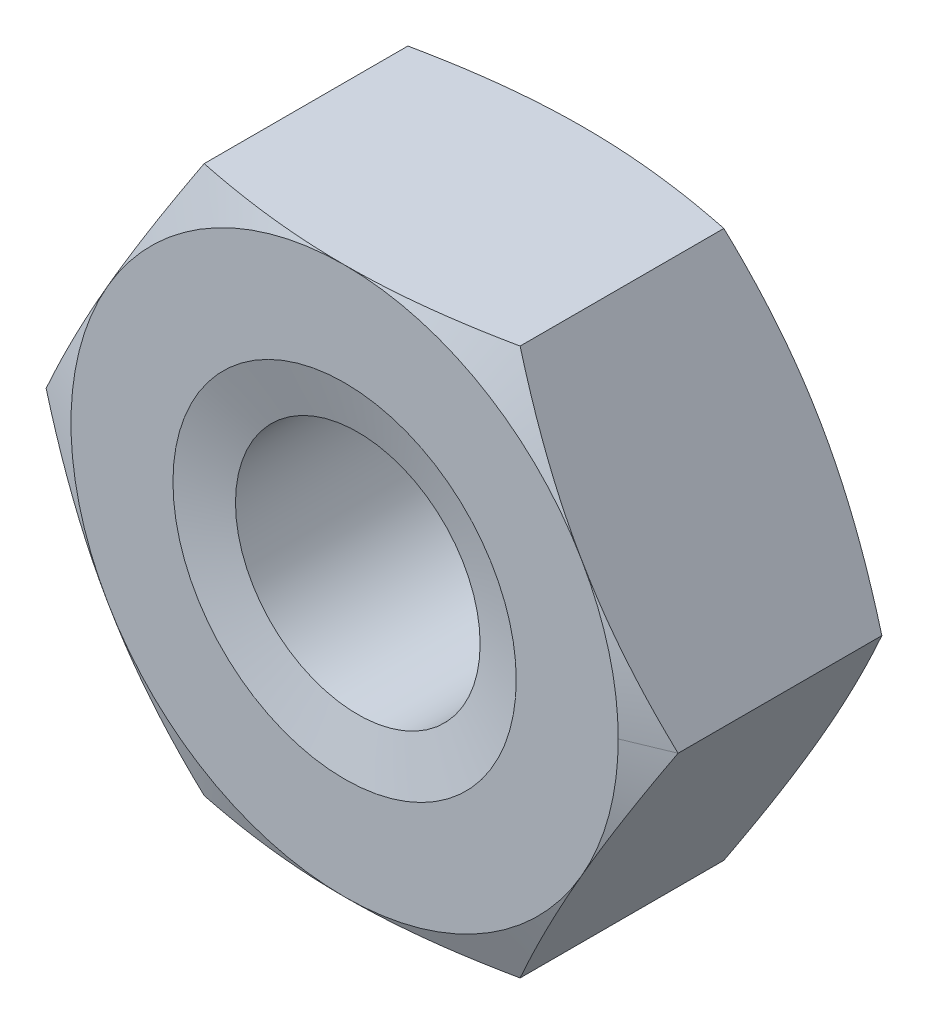
ISO-10303-21;
HEADER;
FILE_DESCRIPTION(('STEP AP214'),'2;1');
FILE_NAME('part.step','',(''),(''),'','','');
FILE_SCHEMA(('AUTOMOTIVE_DESIGN { 1 0 10303 214 1 1 1 1 }'));
ENDSEC;
DATA;
#1=APPLICATION_CONTEXT('core data for automotive mechanical design processes');
#2=APPLICATION_PROTOCOL_DEFINITION('international standard','automotive_design',2000,#1);
#3=PRODUCT_CONTEXT('',#1,'mechanical');
#4=PRODUCT('Part','Part','',(#3));
#5=PRODUCT_RELATED_PRODUCT_CATEGORY('part','',(#4));
#6=PRODUCT_DEFINITION_FORMATION('','',#4);
#7=PRODUCT_DEFINITION_CONTEXT('part definition',#1,'design');
#8=PRODUCT_DEFINITION('design','',#6,#7);
#9=PRODUCT_DEFINITION_SHAPE('','',#8);
#10=(LENGTH_UNIT() NAMED_UNIT(*) SI_UNIT(.MILLI.,.METRE.));
#11=(NAMED_UNIT(*) PLANE_ANGLE_UNIT() SI_UNIT($,.RADIAN.));
#12=(NAMED_UNIT(*) SI_UNIT($,.STERADIAN.) SOLID_ANGLE_UNIT());
#13=UNCERTAINTY_MEASURE_WITH_UNIT(LENGTH_MEASURE(1.E-05),#10,'distance_accuracy_value','');
#14=(GEOMETRIC_REPRESENTATION_CONTEXT(3) GLOBAL_UNCERTAINTY_ASSIGNED_CONTEXT((#13)) GLOBAL_UNIT_ASSIGNED_CONTEXT((#10,
#11,#12)) REPRESENTATION_CONTEXT('',''));
#15=CARTESIAN_POINT('',(0.,0.,0.));
#16=DIRECTION('',(0.,0.,1.));
#17=DIRECTION('',(1.,0.,0.));
#18=AXIS2_PLACEMENT_3D('',#15,#16,#17);
#19=CARTESIAN_POINT('',(0.05,0.05,5.876217418034));
#20=DIRECTION('',(0.,0.,1.));
#21=DIRECTION('',(1.,0.,0.));
#22=AXIS2_PLACEMENT_3D('',#19,#20,#21);
#23=CONICAL_SURFACE('',#22,3.175426480543,1.178097245096);
#24=CARTESIAN_POINT('',(0.05,0.05,5.7));
#25=DIRECTION('',(0.,0.,1.));
#26=DIRECTION('',(1.,0.,0.));
#27=AXIS2_PLACEMENT_3D('',#24,#25,#26);
#28=CIRCLE('',#27,2.75);
#29=CARTESIAN_POINT('',(2.431569853846,-1.325000011364,5.7));
#30=VERTEX_POINT('',#29);
#31=CARTESIAN_POINT('',(2.8,0.05,5.7));
#32=VERTEX_POINT('',#31);
#33=EDGE_CURVE('E174',#30,#32,#28,.T.);
#34=ORIENTED_EDGE('',*,*,#33,.T.);
#35=DIRECTION('',(-0.923879532511277,0.,-0.382683432365114));
#36=VECTOR('',#35,1.);
#37=CARTESIAN_POINT('',(3.225426480543,0.05,5.876217418034));
#38=LINE('',#37,#36);
#39=CARTESIAN_POINT('',(3.225426480543,0.05,5.876217418034));
#40=VERTEX_POINT('',#39);
#41=EDGE_CURVE('E11',#40,#32,#38,.T.);
#42=ORIENTED_EDGE('',*,*,#41,.F.);
#43=CARTESIAN_POINT('',(2.43156985384599,-1.325000011364,5.7));
#44=CARTESIAN_POINT('',(2.79999999648401,-0.686860285275428,5.69999999854361));
#45=CARTESIAN_POINT('',(3.22542648054335,0.0500000000003718,5.87621741803379));
#46=(BOUNDED_CURVE() B_SPLINE_CURVE(2,(#43,#44,#45),.UNSPECIFIED.,.F.,
.F.) B_SPLINE_CURVE_WITH_KNOTS((3,3),(0.,1.),
.UNSPECIFIED.) CURVE() GEOMETRIC_REPRESENTATION_ITEM() RATIONAL_B_SPLINE_CURVE((1.,
1.03795484996562,1.)) REPRESENTATION_ITEM(''));
#47=EDGE_CURVE('E185',#30,#40,#46,.T.);
#48=ORIENTED_EDGE('',*,*,#47,.F.);
#49=EDGE_LOOP('',(#34,#42,#48));
#50=FACE_BOUND('',#49,.T.);
#51=ADVANCED_FACE('F17',(#50),#23,.T.);
#52=CARTESIAN_POINT('',(0.05,0.05,5.876217418034));
#53=DIRECTION('',(0.,0.,1.));
#54=DIRECTION('',(1.,0.,0.));
#55=AXIS2_PLACEMENT_3D('',#52,#53,#54);
#56=CONICAL_SURFACE('',#55,3.175426480543,1.178097245096);
#57=CARTESIAN_POINT('',(0.05,0.05,5.7));
#58=DIRECTION('',(0.,0.,1.));
#59=DIRECTION('',(1.,0.,0.));
#60=AXIS2_PLACEMENT_3D('',#57,#58,#59);
#61=CIRCLE('',#60,2.75);
#62=CARTESIAN_POINT('',(0.05,-2.7,5.7));
#63=VERTEX_POINT('',#62);
#64=EDGE_CURVE('E48',#63,#30,#61,.T.);
#65=ORIENTED_EDGE('',*,*,#64,.T.);
#66=CARTESIAN_POINT('',(1.63771324027164,-2.69999999999865,5.87621741803338));
#67=CARTESIAN_POINT('',(2.06313971729833,-1.96313972690377,5.70000000145639));
#68=CARTESIAN_POINT('',(2.43156985384599,-1.325000011364,5.7));
#69=(BOUNDED_CURVE() B_SPLINE_CURVE(2,(#66,#67,#68),.UNSPECIFIED.,.F.,
.F.) B_SPLINE_CURVE_WITH_KNOTS((3,3),(0.,1.),
.UNSPECIFIED.) CURVE() GEOMETRIC_REPRESENTATION_ITEM() RATIONAL_B_SPLINE_CURVE((1.,
1.03795484863848,1.)) REPRESENTATION_ITEM(''));
#70=CARTESIAN_POINT('',(1.637713240271,-2.7,5.876217418034));
#71=VERTEX_POINT('',#70);
#72=EDGE_CURVE('E189',#71,#30,#69,.T.);
#73=ORIENTED_EDGE('',*,*,#72,.F.);
#74=CARTESIAN_POINT('',(0.05,-2.7,5.7));
#75=CARTESIAN_POINT('',(0.786860279185758,-2.7,5.70000000000001));
#76=CARTESIAN_POINT('',(1.6377132402719,-2.7,5.87621741803363));
#77=(BOUNDED_CURVE() B_SPLINE_CURVE(2,(#74,#75,#76),.UNSPECIFIED.,.F.,
.F.) B_SPLINE_CURVE_WITH_KNOTS((3,3),(0.,1.),
.UNSPECIFIED.) CURVE() GEOMETRIC_REPRESENTATION_ITEM() RATIONAL_B_SPLINE_CURVE((1.,
1.03795484930206,1.)) REPRESENTATION_ITEM(''));
#78=EDGE_CURVE('E181',#63,#71,#77,.T.);
#79=ORIENTED_EDGE('',*,*,#78,.F.);
#80=EDGE_LOOP('',(#65,#73,#79));
#81=FACE_BOUND('',#80,.T.);
#82=ADVANCED_FACE('F188',(#81),#56,.T.);
#83=CARTESIAN_POINT('',(0.05,0.05,5.876217418034));
#84=DIRECTION('',(0.,0.,1.));
#85=DIRECTION('',(1.,0.,0.));
#86=AXIS2_PLACEMENT_3D('',#83,#84,#85);
#87=CONICAL_SURFACE('',#86,3.175426480543,1.178097245096);
#88=CARTESIAN_POINT('',(0.05,0.05,5.7));
#89=DIRECTION('',(0.,0.,1.));
#90=DIRECTION('',(1.,0.,0.));
#91=AXIS2_PLACEMENT_3D('',#88,#89,#90);
#92=CIRCLE('',#91,2.75);
#93=CARTESIAN_POINT('',(-2.331569853846,-1.325000011364,5.7));
#94=VERTEX_POINT('',#93);
#95=EDGE_CURVE('E159',#94,#63,#92,.T.);
#96=ORIENTED_EDGE('',*,*,#95,.T.);
#97=CARTESIAN_POINT('',(-1.5377132402703,-2.7,5.8762174180333));
#98=CARTESIAN_POINT('',(-0.686860279185117,-2.7,5.7));
#99=CARTESIAN_POINT('',(0.05,-2.7,5.7));
#100=(BOUNDED_CURVE() B_SPLINE_CURVE(2,(#97,#98,#99),.UNSPECIFIED.,.F.,
.F.) B_SPLINE_CURVE_WITH_KNOTS((3,3),(0.,1.),
.UNSPECIFIED.) CURVE() GEOMETRIC_REPRESENTATION_ITEM() RATIONAL_B_SPLINE_CURVE((1.,
1.037954849302,1.)) REPRESENTATION_ITEM(''));
#101=CARTESIAN_POINT('',(-1.537713240272,-2.7,5.876217418034));
#102=VERTEX_POINT('',#101);
#103=EDGE_CURVE('E162',#102,#63,#100,.T.);
#104=ORIENTED_EDGE('',*,*,#103,.F.);
#105=CARTESIAN_POINT('',(-2.331569853846,-1.325000011364,5.7));
#106=CARTESIAN_POINT('',(-1.96313971729799,-1.96313972690435,5.70000000145639));
#107=CARTESIAN_POINT('',(-1.53771324027081,-2.70000000000008,5.87621741803372));
#108=(BOUNDED_CURVE() B_SPLINE_CURVE(2,(#105,#106,#107),.UNSPECIFIED.,.F.,
.F.) B_SPLINE_CURVE_WITH_KNOTS((3,3),(0.,1.),
.UNSPECIFIED.) CURVE() GEOMETRIC_REPRESENTATION_ITEM() RATIONAL_B_SPLINE_CURVE((1.,
1.03795484863855,1.)) REPRESENTATION_ITEM(''));
#109=EDGE_CURVE('E165',#94,#102,#108,.T.);
#110=ORIENTED_EDGE('',*,*,#109,.F.);
#111=EDGE_LOOP('',(#96,#104,#110));
#112=FACE_BOUND('',#111,.T.);
#113=ADVANCED_FACE('F160',(#112),#87,.T.);
#114=CARTESIAN_POINT('',(0.05,0.05,5.876217418034));
#115=DIRECTION('',(0.,0.,1.));
#116=DIRECTION('',(1.,0.,0.));
#117=AXIS2_PLACEMENT_3D('',#114,#115,#116);
#118=CONICAL_SURFACE('',#117,3.175426480543,1.178097245096);
#119=CARTESIAN_POINT('',(0.05,0.05,5.7));
#120=DIRECTION('',(0.,0.,1.));
#121=DIRECTION('',(1.,0.,0.));
#122=AXIS2_PLACEMENT_3D('',#119,#120,#121);
#123=CIRCLE('',#122,2.75);
#124=CARTESIAN_POINT('',(-2.331569852224,1.425000014173,5.7));
#125=VERTEX_POINT('',#124);
#126=EDGE_CURVE('E170',#125,#94,#123,.T.);
#127=ORIENTED_EDGE('',*,*,#126,.T.);
#128=CARTESIAN_POINT('',(-3.12542648054229,0.0499999999985272,5.87621741803335));
#129=CARTESIAN_POINT('',(-2.69999999648359,-0.686860285276169,5.69999999854362));
#130=CARTESIAN_POINT('',(-2.331569853846,-1.325000011364,5.7));
#131=(BOUNDED_CURVE() B_SPLINE_CURVE(2,(#128,#129,#130),.UNSPECIFIED.,.F.,
.F.) B_SPLINE_CURVE_WITH_KNOTS((3,3),(0.,1.),
.UNSPECIFIED.) CURVE() GEOMETRIC_REPRESENTATION_ITEM() RATIONAL_B_SPLINE_CURVE((1.,
1.03795484996554,1.)) REPRESENTATION_ITEM(''));
#132=CARTESIAN_POINT('',(-3.125426480543,0.04999999999992,5.876217418034));
#133=VERTEX_POINT('',#132);
#134=EDGE_CURVE('E192',#133,#94,#131,.T.);
#135=ORIENTED_EDGE('',*,*,#134,.F.);
#136=CARTESIAN_POINT('',(-2.33156985222416,1.42500001417309,5.7));
#137=CARTESIAN_POINT('',(-2.69999999561488,0.786860286780804,5.6999999981836));
#138=CARTESIAN_POINT('',(-3.12542648054337,0.0499999999995886,5.8762174180338));
#139=(BOUNDED_CURVE() B_SPLINE_CURVE(2,(#136,#137,#138),.UNSPECIFIED.,.F.,
.F.) B_SPLINE_CURVE_WITH_KNOTS((3,3),(0.,1.),
.UNSPECIFIED.) CURVE() GEOMETRIC_REPRESENTATION_ITEM() RATIONAL_B_SPLINE_CURVE((1.,
1.0379548501297,1.)) REPRESENTATION_ITEM(''));
#140=EDGE_CURVE('E380',#125,#133,#139,.T.);
#141=ORIENTED_EDGE('',*,*,#140,.F.);
#142=EDGE_LOOP('',(#127,#135,#141));
#143=FACE_BOUND('',#142,.T.);
#144=ADVANCED_FACE('F557',(#143),#118,.T.);
#145=CARTESIAN_POINT('',(0.05,0.05,5.876217418034));
#146=DIRECTION('',(0.,0.,1.));
#147=DIRECTION('',(1.,0.,0.));
#148=AXIS2_PLACEMENT_3D('',#145,#146,#147);
#149=CONICAL_SURFACE('',#148,3.175426480543,1.178097245096);
#150=CARTESIAN_POINT('',(0.05,0.05,5.7));
#151=DIRECTION('',(0.,0.,1.));
#152=DIRECTION('',(1.,0.,0.));
#153=AXIS2_PLACEMENT_3D('',#150,#151,#152);
#154=CIRCLE('',#153,2.75);
#155=CARTESIAN_POINT('',(0.05000000000001,2.8,5.7));
#156=VERTEX_POINT('',#155);
#157=EDGE_CURVE('E222',#156,#125,#154,.T.);
#158=ORIENTED_EDGE('',*,*,#157,.T.);
#159=CARTESIAN_POINT('',(-1.53771324027214,2.79999999999778,5.87621741803317));
#160=CARTESIAN_POINT('',(-1.96313971642939,2.06313972840882,5.70000000181639));
#161=CARTESIAN_POINT('',(-2.33156985222416,1.42500001417309,5.7));
#162=(BOUNDED_CURVE() B_SPLINE_CURVE(2,(#159,#160,#161),.UNSPECIFIED.,.F.,
.F.) B_SPLINE_CURVE_WITH_KNOTS((3,3),(0.,1.),
.UNSPECIFIED.) CURVE() GEOMETRIC_REPRESENTATION_ITEM() RATIONAL_B_SPLINE_CURVE((1.,
1.03795484847438,1.)) REPRESENTATION_ITEM(''));
#163=CARTESIAN_POINT('',(-1.537713240272,2.8,5.876217418034));
#164=VERTEX_POINT('',#163);
#165=EDGE_CURVE('E390',#164,#125,#162,.T.);
#166=ORIENTED_EDGE('',*,*,#165,.F.);
#167=CARTESIAN_POINT('',(0.0500000000000101,2.8,5.7));
#168=CARTESIAN_POINT('',(-0.686860279186023,2.8,5.70000000000001));
#169=CARTESIAN_POINT('',(-1.53771324027256,2.8,5.87621741803377));
#170=(BOUNDED_CURVE() B_SPLINE_CURVE(2,(#167,#168,#169),.UNSPECIFIED.,.F.,
.F.) B_SPLINE_CURVE_WITH_KNOTS((3,3),(0.,1.),
.UNSPECIFIED.) CURVE() GEOMETRIC_REPRESENTATION_ITEM() RATIONAL_B_SPLINE_CURVE((1.,
1.03795484930212,1.)) REPRESENTATION_ITEM(''));
#171=EDGE_CURVE('E273',#156,#164,#170,.T.);
#172=ORIENTED_EDGE('',*,*,#171,.F.);
#173=EDGE_LOOP('',(#158,#166,#172));
#174=FACE_BOUND('',#173,.T.);
#175=ADVANCED_FACE('F561',(#174),#149,.T.);
#176=CARTESIAN_POINT('',(0.05,0.05,5.876217418034));
#177=DIRECTION('',(0.,0.,1.));
#178=DIRECTION('',(1.,0.,0.));
#179=AXIS2_PLACEMENT_3D('',#176,#177,#178);
#180=CONICAL_SURFACE('',#179,3.175426480543,1.178097245096);
#181=CARTESIAN_POINT('',(0.05,0.05,5.7));
#182=DIRECTION('',(0.,0.,1.));
#183=DIRECTION('',(1.,0.,0.));
#184=AXIS2_PLACEMENT_3D('',#181,#182,#183);
#185=CIRCLE('',#184,2.75);
#186=CARTESIAN_POINT('',(2.431569853846,1.425000011364,5.7));
#187=VERTEX_POINT('',#186);
#188=EDGE_CURVE('E224',#187,#156,#185,.T.);
#189=ORIENTED_EDGE('',*,*,#188,.T.);
#190=CARTESIAN_POINT('',(1.6377132402683,2.8,5.87621741803288));
#191=CARTESIAN_POINT('',(0.78686027918432,2.8,5.7));
#192=CARTESIAN_POINT('',(0.0500000000000101,2.8,5.7));
#193=(BOUNDED_CURVE() B_SPLINE_CURVE(2,(#190,#191,#192),.UNSPECIFIED.,.F.,
.F.) B_SPLINE_CURVE_WITH_KNOTS((3,3),(0.,1.),
.UNSPECIFIED.) CURVE() GEOMETRIC_REPRESENTATION_ITEM() RATIONAL_B_SPLINE_CURVE((1.,
1.0379548493019,1.)) REPRESENTATION_ITEM(''));
#194=CARTESIAN_POINT('',(1.637713240271,2.8,5.876217418034));
#195=VERTEX_POINT('',#194);
#196=EDGE_CURVE('E374',#195,#156,#193,.T.);
#197=ORIENTED_EDGE('',*,*,#196,.F.);
#198=CARTESIAN_POINT('',(2.43156985384599,1.425000011364,5.7));
#199=CARTESIAN_POINT('',(2.06313971729793,2.06313972690447,5.70000000145639));
#200=CARTESIAN_POINT('',(1.63771324027065,2.80000000000037,5.87621741803379));
#201=(BOUNDED_CURVE() B_SPLINE_CURVE(2,(#198,#199,#200),.UNSPECIFIED.,.F.,
.F.) B_SPLINE_CURVE_WITH_KNOTS((3,3),(0.,1.),
.UNSPECIFIED.) CURVE() GEOMETRIC_REPRESENTATION_ITEM() RATIONAL_B_SPLINE_CURVE((1.,
1.0379548486386,1.)) REPRESENTATION_ITEM(''));
#202=EDGE_CURVE('E353',#187,#195,#201,.T.);
#203=ORIENTED_EDGE('',*,*,#202,.F.);
#204=EDGE_LOOP('',(#189,#197,#203));
#205=FACE_BOUND('',#204,.T.);
#206=ADVANCED_FACE('F523',(#205),#180,.T.);
#207=CARTESIAN_POINT('',(0.05,0.05,5.876217418034));
#208=DIRECTION('',(0.,0.,1.));
#209=DIRECTION('',(1.,0.,0.));
#210=AXIS2_PLACEMENT_3D('',#207,#208,#209);
#211=CONICAL_SURFACE('',#210,3.175426480543,1.178097245096);
#212=CARTESIAN_POINT('',(0.05,0.05,5.7));
#213=DIRECTION('',(0.,0.,1.));
#214=DIRECTION('',(1.,0.,0.));
#215=AXIS2_PLACEMENT_3D('',#212,#213,#214);
#216=CIRCLE('',#215,2.75);
#217=EDGE_CURVE('E25',#32,#187,#216,.T.);
#218=ORIENTED_EDGE('',*,*,#217,.T.);
#219=CARTESIAN_POINT('',(3.22542648054235,0.0500000000013523,5.87621741803338));
#220=CARTESIAN_POINT('',(2.7999999964836,0.786860285276121,5.6999999985436));
#221=CARTESIAN_POINT('',(2.43156985384599,1.425000011364,5.7));
#222=(BOUNDED_CURVE() B_SPLINE_CURVE(2,(#219,#220,#221),.UNSPECIFIED.,.F.,
.F.) B_SPLINE_CURVE_WITH_KNOTS((3,3),(0.,1.),
.UNSPECIFIED.) CURVE() GEOMETRIC_REPRESENTATION_ITEM() RATIONAL_B_SPLINE_CURVE((1.,
1.03795484996555,1.)) REPRESENTATION_ITEM(''));
#223=EDGE_CURVE('E283',#40,#187,#222,.T.);
#224=ORIENTED_EDGE('',*,*,#223,.F.);
#225=ORIENTED_EDGE('',*,*,#41,.T.);
#226=EDGE_LOOP('',(#218,#224,#225));
#227=FACE_BOUND('',#226,.T.);
#228=ADVANCED_FACE('F514',(#227),#211,.T.);
#229=CARTESIAN_POINT('',(0.05,0.05,5.7));
#230=DIRECTION('',(0.,0.,1.));
#231=DIRECTION('',(1.,0.,0.));
#232=AXIS2_PLACEMENT_3D('',#229,#230,#231);
#233=PLANE('',#232);
#234=CARTESIAN_POINT('',(0.05,0.05,5.7));
#235=DIRECTION('',(0.,0.,1.));
#236=DIRECTION('',(1.,0.,0.));
#237=AXIS2_PLACEMENT_3D('',#234,#235,#236);
#238=CIRCLE('',#237,1.725);
#239=CARTESIAN_POINT('',(1.775,0.05,5.7));
#240=VERTEX_POINT('',#239);
#241=EDGE_CURVE('E347',#240,#240,#238,.T.);
#242=ORIENTED_EDGE('',*,*,#241,.T.);
#243=EDGE_LOOP('',(#242));
#244=FACE_BOUND('',#243,.T.);
#245=ORIENTED_EDGE('',*,*,#33,.F.);
#246=ORIENTED_EDGE('',*,*,#64,.F.);
#247=ORIENTED_EDGE('',*,*,#95,.F.);
#248=ORIENTED_EDGE('',*,*,#126,.F.);
#249=ORIENTED_EDGE('',*,*,#157,.F.);
#250=ORIENTED_EDGE('',*,*,#188,.F.);
#251=ORIENTED_EDGE('',*,*,#217,.F.);
#252=EDGE_LOOP('',(#245,#246,#247,#248,#249,#250,#251));
#253=FACE_BOUND('',#252,.T.);
#254=ADVANCED_FACE('F172',(#244,#253),#233,.F.);
#255=CARTESIAN_POINT('',(1.637713240271,-2.7,5.7));
#256=DIRECTION('',(-0.866025403784329,0.50000000000019,0.));
#257=DIRECTION('',(0.,0.,1.));
#258=AXIS2_PLACEMENT_3D('',#255,#256,#257);
#259=PLANE('',#258);
#260=ORIENTED_EDGE('',*,*,#47,.T.);
#261=DIRECTION('',(0.,0.,-1.));
#262=VECTOR('',#261,1.);
#263=CARTESIAN_POINT('',(3.225426480543,0.05,7.923782581966));
#264=LINE('',#263,#262);
#265=CARTESIAN_POINT('',(3.225426480543,0.05,7.923782581966));
#266=VERTEX_POINT('',#265);
#267=EDGE_CURVE('E301',#266,#40,#264,.T.);
#268=ORIENTED_EDGE('',*,*,#267,.F.);
#269=CARTESIAN_POINT('',(3.22542648054235,0.0499999999986478,7.92378258196662));
#270=CARTESIAN_POINT('',(2.7999999964836,-0.686860285276121,8.10000000145638));
#271=CARTESIAN_POINT('',(2.43156985384599,-1.325000011364,8.1));
#272=(BOUNDED_CURVE() B_SPLINE_CURVE(2,(#269,#270,#271),.UNSPECIFIED.,.F.,
.F.) B_SPLINE_CURVE_WITH_KNOTS((3,3),(0.,1.),
.UNSPECIFIED.) CURVE() GEOMETRIC_REPRESENTATION_ITEM() RATIONAL_B_SPLINE_CURVE((1.,
1.03795484996555,1.)) REPRESENTATION_ITEM(''));
#273=CARTESIAN_POINT('',(2.431569853846,-1.325000011364,8.1));
#274=VERTEX_POINT('',#273);
#275=EDGE_CURVE('E338',#266,#274,#272,.T.);
#276=ORIENTED_EDGE('',*,*,#275,.T.);
#277=CARTESIAN_POINT('',(2.43156985384599,-1.325000011364,8.1));
#278=CARTESIAN_POINT('',(2.06313971729793,-1.96313972690447,8.09999999854361));
#279=CARTESIAN_POINT('',(1.63771324027065,-2.70000000000037,7.92378258196621));
#280=(BOUNDED_CURVE() B_SPLINE_CURVE(2,(#277,#278,#279),.UNSPECIFIED.,.F.,
.F.) B_SPLINE_CURVE_WITH_KNOTS((3,3),(0.,1.),
.UNSPECIFIED.) CURVE() GEOMETRIC_REPRESENTATION_ITEM() RATIONAL_B_SPLINE_CURVE((1.,
1.03795484863856,1.)) REPRESENTATION_ITEM(''));
#281=CARTESIAN_POINT('',(1.637713240271,-2.7,7.923782581966));
#282=VERTEX_POINT('',#281);
#283=EDGE_CURVE('E329',#274,#282,#280,.T.);
#284=ORIENTED_EDGE('',*,*,#283,.T.);
#285=DIRECTION('',(0.,0.,1.));
#286=VECTOR('',#285,1.);
#287=CARTESIAN_POINT('',(1.637713240271,-2.7,5.7));
#288=LINE('',#287,#286);
#289=EDGE_CURVE('E186',#71,#282,#288,.T.);
#290=ORIENTED_EDGE('',*,*,#289,.F.);
#291=ORIENTED_EDGE('',*,*,#72,.T.);
#292=EDGE_LOOP('',(#260,#268,#276,#284,#290,#291));
#293=FACE_BOUND('',#292,.T.);
#294=ADVANCED_FACE('F513',(#293),#259,.F.);
#295=CARTESIAN_POINT('',(-1.537713240271,-2.7,5.7));
#296=DIRECTION('',(0.,1.,0.));
#297=DIRECTION('',(1.,0.,0.));
#298=AXIS2_PLACEMENT_3D('',#295,#296,#297);
#299=PLANE('',#298);
#300=ORIENTED_EDGE('',*,*,#78,.T.);
#301=ORIENTED_EDGE('',*,*,#289,.T.);
#302=CARTESIAN_POINT('',(1.6377132402683,-2.7,7.92378258196712));
#303=CARTESIAN_POINT('',(0.786860279184316,-2.70000000000001,8.10000000000001));
#304=CARTESIAN_POINT('',(0.05,-2.7,8.1));
#305=(BOUNDED_CURVE() B_SPLINE_CURVE(2,(#302,#303,#304),.UNSPECIFIED.,.F.,
.F.) B_SPLINE_CURVE_WITH_KNOTS((3,3),(0.,1.),
.UNSPECIFIED.) CURVE() GEOMETRIC_REPRESENTATION_ITEM() RATIONAL_B_SPLINE_CURVE((1.,
1.03795484930192,1.)) REPRESENTATION_ITEM(''));
#306=CARTESIAN_POINT('',(0.05,-2.7,8.1));
#307=VERTEX_POINT('',#306);
#308=EDGE_CURVE('E321',#282,#307,#305,.T.);
#309=ORIENTED_EDGE('',*,*,#308,.T.);
#310=CARTESIAN_POINT('',(0.05,-2.7,8.1));
#311=CARTESIAN_POINT('',(-0.68686027918603,-2.7,8.10000000000001));
#312=CARTESIAN_POINT('',(-1.53771324027256,-2.7,7.92378258196624));
#313=(BOUNDED_CURVE() B_SPLINE_CURVE(2,(#310,#311,#312),.UNSPECIFIED.,.F.,
.F.) B_SPLINE_CURVE_WITH_KNOTS((3,3),(0.,1.),
.UNSPECIFIED.) CURVE() GEOMETRIC_REPRESENTATION_ITEM() RATIONAL_B_SPLINE_CURVE((1.,
1.0379548493021,1.)) REPRESENTATION_ITEM(''));
#314=CARTESIAN_POINT('',(-1.537713240272,-2.7,7.923782581966));
#315=VERTEX_POINT('',#314);
#316=EDGE_CURVE('E313',#307,#315,#313,.T.);
#317=ORIENTED_EDGE('',*,*,#316,.T.);
#318=DIRECTION('',(0.,0.,1.));
#319=VECTOR('',#318,1.);
#320=CARTESIAN_POINT('',(-1.537713240271,-2.7,5.7));
#321=LINE('',#320,#319);
#322=EDGE_CURVE('E183',#102,#315,#321,.T.);
#323=ORIENTED_EDGE('',*,*,#322,.F.);
#324=ORIENTED_EDGE('',*,*,#103,.T.);
#325=EDGE_LOOP('',(#300,#301,#309,#317,#323,#324));
#326=FACE_BOUND('',#325,.T.);
#327=ADVANCED_FACE('F180',(#326),#299,.F.);
#328=CARTESIAN_POINT('',(-3.125426480543,0.05,5.7));
#329=DIRECTION('',(0.866025403784329,0.50000000000019,0.));
#330=DIRECTION('',(0.,0.,-1.));
#331=AXIS2_PLACEMENT_3D('',#328,#329,#330);
#332=PLANE('',#331);
#333=ORIENTED_EDGE('',*,*,#109,.T.);
#334=ORIENTED_EDGE('',*,*,#322,.T.);
#335=CARTESIAN_POINT('',(-1.53771324027214,-2.69999999999778,7.92378258196683));
#336=CARTESIAN_POINT('',(-1.96313971729852,-1.96313972690343,8.09999999854361));
#337=CARTESIAN_POINT('',(-2.331569853846,-1.325000011364,8.1));
#338=(BOUNDED_CURVE() B_SPLINE_CURVE(2,(#335,#336,#337),.UNSPECIFIED.,.F.,
.F.) B_SPLINE_CURVE_WITH_KNOTS((3,3),(0.,1.),
.UNSPECIFIED.) CURVE() GEOMETRIC_REPRESENTATION_ITEM() RATIONAL_B_SPLINE_CURVE((1.,
1.03795484863841,1.)) REPRESENTATION_ITEM(''));
#339=CARTESIAN_POINT('',(-2.331569853846,-1.325000011364,8.1));
#340=VERTEX_POINT('',#339);
#341=EDGE_CURVE('E300',#315,#340,#338,.T.);
#342=ORIENTED_EDGE('',*,*,#341,.T.);
#343=CARTESIAN_POINT('',(-2.331569853846,-1.325000011364,8.1));
#344=CARTESIAN_POINT('',(-2.699999996484,-0.686860285275444,8.10000000145639));
#345=CARTESIAN_POINT('',(-3.12542648054333,0.0500000000003313,7.92378258196622));
#346=(BOUNDED_CURVE() B_SPLINE_CURVE(2,(#343,#344,#345),.UNSPECIFIED.,.F.,
.F.) B_SPLINE_CURVE_WITH_KNOTS((3,3),(0.,1.),
.UNSPECIFIED.) CURVE() GEOMETRIC_REPRESENTATION_ITEM() RATIONAL_B_SPLINE_CURVE((1.,
1.03795484996559,1.)) REPRESENTATION_ITEM(''));
#347=CARTESIAN_POINT('',(-3.125426480543,0.04999999999992,7.923782581966));
#348=VERTEX_POINT('',#347);
#349=EDGE_CURVE('E272',#340,#348,#346,.T.);
#350=ORIENTED_EDGE('',*,*,#349,.T.);
#351=DIRECTION('',(0.,0.,1.));
#352=VECTOR('',#351,1.);
#353=CARTESIAN_POINT('',(-3.125426480543,0.05,5.7));
#354=LINE('',#353,#352);
#355=EDGE_CURVE('E389',#133,#348,#354,.T.);
#356=ORIENTED_EDGE('',*,*,#355,.F.);
#357=ORIENTED_EDGE('',*,*,#134,.T.);
#358=EDGE_LOOP('',(#333,#334,#342,#350,#356,#357));
#359=FACE_BOUND('',#358,.T.);
#360=ADVANCED_FACE('F411',(#359),#332,.F.);
#361=CARTESIAN_POINT('',(-1.537713240271,2.8,5.7));
#362=DIRECTION('',(0.866025403784329,-0.50000000000019,0.));
#363=DIRECTION('',(0.,0.,-1.));
#364=AXIS2_PLACEMENT_3D('',#361,#362,#363);
#365=PLANE('',#364);
#366=ORIENTED_EDGE('',*,*,#140,.T.);
#367=ORIENTED_EDGE('',*,*,#355,.T.);
#368=CARTESIAN_POINT('',(-3.12542648054243,0.0500000000012324,7.92378258196659));
#369=CARTESIAN_POINT('',(-2.6999999956145,0.786860286781462,8.10000000181639));
#370=CARTESIAN_POINT('',(-2.33156985222416,1.42500001417309,8.1));
#371=(BOUNDED_CURVE() B_SPLINE_CURVE(2,(#368,#369,#370),.UNSPECIFIED.,.F.,
.F.) B_SPLINE_CURVE_WITH_KNOTS((3,3),(0.,1.),
.UNSPECIFIED.) CURVE() GEOMETRIC_REPRESENTATION_ITEM() RATIONAL_B_SPLINE_CURVE((1.,
1.0379548501296,1.)) REPRESENTATION_ITEM(''));
#372=CARTESIAN_POINT('',(-2.331569852224,1.425000014173,8.1));
#373=VERTEX_POINT('',#372);
#374=EDGE_CURVE('E292',#348,#373,#371,.T.);
#375=ORIENTED_EDGE('',*,*,#374,.T.);
#376=CARTESIAN_POINT('',(-2.33156985222416,1.42500001417309,8.1));
#377=CARTESIAN_POINT('',(-1.96313971642885,2.06313972840974,8.09999999818361));
#378=CARTESIAN_POINT('',(-1.53771324027081,2.80000000000009,7.92378258196628));
#379=(BOUNDED_CURVE() B_SPLINE_CURVE(2,(#376,#377,#378),.UNSPECIFIED.,.F.,
.F.) B_SPLINE_CURVE_WITH_KNOTS((3,3),(0.,1.),
.UNSPECIFIED.) CURVE() GEOMETRIC_REPRESENTATION_ITEM() RATIONAL_B_SPLINE_CURVE((1.,
1.03795484847454,1.)) REPRESENTATION_ITEM(''));
#380=CARTESIAN_POINT('',(-1.537713240272,2.8,7.923782581966));
#381=VERTEX_POINT('',#380);
#382=EDGE_CURVE('E253',#373,#381,#379,.T.);
#383=ORIENTED_EDGE('',*,*,#382,.T.);
#384=DIRECTION('',(0.,0.,1.));
#385=VECTOR('',#384,1.);
#386=CARTESIAN_POINT('',(-1.537713240271,2.8,5.7));
#387=LINE('',#386,#385);
#388=EDGE_CURVE('E282',#164,#381,#387,.T.);
#389=ORIENTED_EDGE('',*,*,#388,.F.);
#390=ORIENTED_EDGE('',*,*,#165,.T.);
#391=EDGE_LOOP('',(#366,#367,#375,#383,#389,#390));
#392=FACE_BOUND('',#391,.T.);
#393=ADVANCED_FACE('F552',(#392),#365,.F.);
#394=CARTESIAN_POINT('',(1.637713240271,2.8,5.7));
#395=DIRECTION('',(0.,-1.,0.));
#396=DIRECTION('',(-1.,0.,0.));
#397=AXIS2_PLACEMENT_3D('',#394,#395,#396);
#398=PLANE('',#397);
#399=ORIENTED_EDGE('',*,*,#171,.T.);
#400=ORIENTED_EDGE('',*,*,#388,.T.);
#401=CARTESIAN_POINT('',(-1.5377132402703,2.8,7.9237825819667));
#402=CARTESIAN_POINT('',(-0.686860279185112,2.8,8.1));
#403=CARTESIAN_POINT('',(0.0500000000000098,2.8,8.1));
#404=(BOUNDED_CURVE() B_SPLINE_CURVE(2,(#401,#402,#403),.UNSPECIFIED.,.F.,
.F.) B_SPLINE_CURVE_WITH_KNOTS((3,3),(0.,1.),
.UNSPECIFIED.) CURVE() GEOMETRIC_REPRESENTATION_ITEM() RATIONAL_B_SPLINE_CURVE((1.,
1.037954849302,1.)) REPRESENTATION_ITEM(''));
#405=CARTESIAN_POINT('',(0.05000000000001,2.8,8.1));
#406=VERTEX_POINT('',#405);
#407=EDGE_CURVE('E264',#381,#406,#404,.T.);
#408=ORIENTED_EDGE('',*,*,#407,.T.);
#409=CARTESIAN_POINT('',(0.0500000000000098,2.8,8.1));
#410=CARTESIAN_POINT('',(0.786860279185767,2.8,8.1));
#411=CARTESIAN_POINT('',(1.6377132402719,2.8,7.92378258196637));
#412=(BOUNDED_CURVE() B_SPLINE_CURVE(2,(#409,#410,#411),.UNSPECIFIED.,.F.,
.F.) B_SPLINE_CURVE_WITH_KNOTS((3,3),(0.,1.),
.UNSPECIFIED.) CURVE() GEOMETRIC_REPRESENTATION_ITEM() RATIONAL_B_SPLINE_CURVE((1.,
1.03795484930204,1.)) REPRESENTATION_ITEM(''));
#413=CARTESIAN_POINT('',(1.637713240271,2.8,7.923782581966));
#414=VERTEX_POINT('',#413);
#415=EDGE_CURVE('E240',#406,#414,#412,.T.);
#416=ORIENTED_EDGE('',*,*,#415,.T.);
#417=DIRECTION('',(0.,0.,1.));
#418=VECTOR('',#417,1.);
#419=CARTESIAN_POINT('',(1.637713240271,2.8,5.7));
#420=LINE('',#419,#418);
#421=EDGE_CURVE('E308',#195,#414,#420,.T.);
#422=ORIENTED_EDGE('',*,*,#421,.F.);
#423=ORIENTED_EDGE('',*,*,#196,.T.);
#424=EDGE_LOOP('',(#399,#400,#408,#416,#422,#423));
#425=FACE_BOUND('',#424,.T.);
#426=ADVANCED_FACE('F560',(#425),#398,.F.);
#427=CARTESIAN_POINT('',(3.225426480543,0.05,5.7));
#428=DIRECTION('',(-0.866025403784329,-0.50000000000019,0.));
#429=DIRECTION('',(-0.50000000000019,0.866025403784329,0.));
#430=AXIS2_PLACEMENT_3D('',#427,#428,#429);
#431=PLANE('',#430);
#432=ORIENTED_EDGE('',*,*,#202,.T.);
#433=ORIENTED_EDGE('',*,*,#421,.T.);
#434=CARTESIAN_POINT('',(1.63771324027164,2.79999999999865,7.92378258196662));
#435=CARTESIAN_POINT('',(2.06313971729832,2.06313972690378,8.09999999854361));
#436=CARTESIAN_POINT('',(2.43156985384599,1.425000011364,8.1));
#437=(BOUNDED_CURVE() B_SPLINE_CURVE(2,(#434,#435,#436),.UNSPECIFIED.,.F.,
.F.) B_SPLINE_CURVE_WITH_KNOTS((3,3),(0.,1.),
.UNSPECIFIED.) CURVE() GEOMETRIC_REPRESENTATION_ITEM() RATIONAL_B_SPLINE_CURVE((1.,
1.03795484863847,1.)) REPRESENTATION_ITEM(''));
#438=CARTESIAN_POINT('',(2.431569853846,1.425000011364,8.1));
#439=VERTEX_POINT('',#438);
#440=EDGE_CURVE('E245',#414,#439,#437,.T.);
#441=ORIENTED_EDGE('',*,*,#440,.T.);
#442=CARTESIAN_POINT('',(2.43156985384599,1.425000011364,8.1));
#443=CARTESIAN_POINT('',(2.79999999648401,0.786860285275428,8.10000000145639));
#444=CARTESIAN_POINT('',(3.22542648054335,0.0499999999996283,7.92378258196621));
#445=(BOUNDED_CURVE() B_SPLINE_CURVE(2,(#442,#443,#444),.UNSPECIFIED.,.F.,
.F.) B_SPLINE_CURVE_WITH_KNOTS((3,3),(0.,1.),
.UNSPECIFIED.) CURVE() GEOMETRIC_REPRESENTATION_ITEM() RATIONAL_B_SPLINE_CURVE((1.,
1.03795484996562,1.)) REPRESENTATION_ITEM(''));
#446=EDGE_CURVE('E467',#439,#266,#445,.T.);
#447=ORIENTED_EDGE('',*,*,#446,.T.);
#448=ORIENTED_EDGE('',*,*,#267,.T.);
#449=ORIENTED_EDGE('',*,*,#223,.T.);
#450=EDGE_LOOP('',(#432,#433,#441,#447,#448,#449));
#451=FACE_BOUND('',#450,.T.);
#452=ADVANCED_FACE('F533',(#451),#431,.F.);
#453=CARTESIAN_POINT('',(0.05,0.05,5.7));
#454=DIRECTION('',(0.,0.,-1.));
#455=DIRECTION('',(1.,0.,0.));
#456=AXIS2_PLACEMENT_3D('',#453,#454,#455);
#457=CONICAL_SURFACE('',#456,1.725,1.308996938996);
#458=CARTESIAN_POINT('',(0.05,0.05,5.832804445662));
#459=DIRECTION('',(0.,0.,1.));
#460=DIRECTION('',(1.,0.,0.));
#461=AXIS2_PLACEMENT_3D('',#458,#459,#460);
#462=CIRCLE('',#461,1.229367061317);
#463=CARTESIAN_POINT('',(1.279367061317,0.05,5.832804445662));
#464=VERTEX_POINT('',#463);
#465=EDGE_CURVE('E464',#464,#464,#462,.T.);
#466=ORIENTED_EDGE('',*,*,#465,.T.);
#467=DIRECTION('',(-0.965925826288944,0.,0.258819045102985));
#468=VECTOR('',#467,1.);
#469=CARTESIAN_POINT('',(1.775,0.05,5.7));
#470=LINE('',#469,#468);
#471=EDGE_CURVE('E346',#240,#464,#470,.T.);
#472=ORIENTED_EDGE('',*,*,#471,.F.);
#473=ORIENTED_EDGE('',*,*,#241,.F.);
#474=ORIENTED_EDGE('',*,*,#471,.T.);
#475=EDGE_LOOP('',(#466,#472,#473,#474));
#476=FACE_BOUND('',#475,.T.);
#477=ADVANCED_FACE('F510',(#476),#457,.F.);
#478=CARTESIAN_POINT('',(0.05,0.05,8.1));
#479=DIRECTION('',(0.,0.,-1.));
#480=DIRECTION('',(1.,0.,0.));
#481=AXIS2_PLACEMENT_3D('',#478,#479,#480);
#482=CONICAL_SURFACE('',#481,2.75,1.178097245096);
#483=ORIENTED_EDGE('',*,*,#275,.F.);
#484=DIRECTION('',(0.923879532511277,0.,-0.382683432365114));
#485=VECTOR('',#484,1.);
#486=CARTESIAN_POINT('',(2.8,0.05,8.1));
#487=LINE('',#486,#485);
#488=CARTESIAN_POINT('',(2.8,0.05,8.1));
#489=VERTEX_POINT('',#488);
#490=EDGE_CURVE('E238',#489,#266,#487,.T.);
#491=ORIENTED_EDGE('',*,*,#490,.F.);
#492=CARTESIAN_POINT('',(0.05,0.05,8.1));
#493=DIRECTION('',(0.,0.,1.));
#494=DIRECTION('',(1.,0.,0.));
#495=AXIS2_PLACEMENT_3D('',#492,#493,#494);
#496=CIRCLE('',#495,2.75);
#497=EDGE_CURVE('E455',#274,#489,#496,.T.);
#498=ORIENTED_EDGE('',*,*,#497,.F.);
#499=EDGE_LOOP('',(#483,#491,#498));
#500=FACE_BOUND('',#499,.T.);
#501=ADVANCED_FACE('F670',(#500),#482,.T.);
#502=CARTESIAN_POINT('',(0.05,0.05,8.1));
#503=DIRECTION('',(0.,0.,-1.));
#504=DIRECTION('',(1.,0.,0.));
#505=AXIS2_PLACEMENT_3D('',#502,#503,#504);
#506=CONICAL_SURFACE('',#505,2.75,1.178097245096);
#507=ORIENTED_EDGE('',*,*,#308,.F.);
#508=ORIENTED_EDGE('',*,*,#283,.F.);
#509=CARTESIAN_POINT('',(0.05,0.05,8.1));
#510=DIRECTION('',(0.,0.,1.));
#511=DIRECTION('',(1.,0.,0.));
#512=AXIS2_PLACEMENT_3D('',#509,#510,#511);
#513=CIRCLE('',#512,2.75);
#514=EDGE_CURVE('E426',#307,#274,#513,.T.);
#515=ORIENTED_EDGE('',*,*,#514,.F.);
#516=EDGE_LOOP('',(#507,#508,#515));
#517=FACE_BOUND('',#516,.T.);
#518=ADVANCED_FACE('F679',(#517),#506,.T.);
#519=CARTESIAN_POINT('',(0.05,0.05,8.1));
#520=DIRECTION('',(0.,0.,-1.));
#521=DIRECTION('',(1.,0.,0.));
#522=AXIS2_PLACEMENT_3D('',#519,#520,#521);
#523=CONICAL_SURFACE('',#522,2.75,1.178097245096);
#524=ORIENTED_EDGE('',*,*,#341,.F.);
#525=ORIENTED_EDGE('',*,*,#316,.F.);
#526=CARTESIAN_POINT('',(0.05,0.05,8.1));
#527=DIRECTION('',(0.,0.,1.));
#528=DIRECTION('',(1.,0.,0.));
#529=AXIS2_PLACEMENT_3D('',#526,#527,#528);
#530=CIRCLE('',#529,2.75);
#531=EDGE_CURVE('E421',#340,#307,#530,.T.);
#532=ORIENTED_EDGE('',*,*,#531,.F.);
#533=EDGE_LOOP('',(#524,#525,#532));
#534=FACE_BOUND('',#533,.T.);
#535=ADVANCED_FACE('F419',(#534),#523,.T.);
#536=CARTESIAN_POINT('',(0.05,0.05,8.1));
#537=DIRECTION('',(0.,0.,-1.));
#538=DIRECTION('',(1.,0.,0.));
#539=AXIS2_PLACEMENT_3D('',#536,#537,#538);
#540=CONICAL_SURFACE('',#539,2.75,1.178097245096);
#541=ORIENTED_EDGE('',*,*,#349,.F.);
#542=CARTESIAN_POINT('',(0.05,0.05,8.1));
#543=DIRECTION('',(0.,0.,1.));
#544=DIRECTION('',(1.,0.,0.));
#545=AXIS2_PLACEMENT_3D('',#542,#543,#544);
#546=CIRCLE('',#545,2.75);
#547=EDGE_CURVE('E427',#373,#340,#546,.T.);
#548=ORIENTED_EDGE('',*,*,#547,.F.);
#549=ORIENTED_EDGE('',*,*,#374,.F.);
#550=EDGE_LOOP('',(#541,#548,#549));
#551=FACE_BOUND('',#550,.T.);
#552=ADVANCED_FACE('F554',(#551),#540,.T.);
#553=CARTESIAN_POINT('',(0.05,0.05,8.1));
#554=DIRECTION('',(0.,0.,-1.));
#555=DIRECTION('',(1.,0.,0.));
#556=AXIS2_PLACEMENT_3D('',#553,#554,#555);
#557=CONICAL_SURFACE('',#556,2.75,1.178097245096);
#558=ORIENTED_EDGE('',*,*,#382,.F.);
#559=CARTESIAN_POINT('',(0.05,0.05,8.1));
#560=DIRECTION('',(0.,0.,1.));
#561=DIRECTION('',(1.,0.,0.));
#562=AXIS2_PLACEMENT_3D('',#559,#560,#561);
#563=CIRCLE('',#562,2.75);
#564=EDGE_CURVE('E435',#406,#373,#563,.T.);
#565=ORIENTED_EDGE('',*,*,#564,.F.);
#566=ORIENTED_EDGE('',*,*,#407,.F.);
#567=EDGE_LOOP('',(#558,#565,#566));
#568=FACE_BOUND('',#567,.T.);
#569=ADVANCED_FACE('F549',(#568),#557,.T.);
#570=CARTESIAN_POINT('',(0.05,0.05,8.1));
#571=DIRECTION('',(0.,0.,-1.));
#572=DIRECTION('',(1.,0.,0.));
#573=AXIS2_PLACEMENT_3D('',#570,#571,#572);
#574=CONICAL_SURFACE('',#573,2.75,1.178097245096);
#575=ORIENTED_EDGE('',*,*,#415,.F.);
#576=CARTESIAN_POINT('',(0.05,0.05,8.1));
#577=DIRECTION('',(0.,0.,1.));
#578=DIRECTION('',(1.,0.,0.));
#579=AXIS2_PLACEMENT_3D('',#576,#577,#578);
#580=CIRCLE('',#579,2.75);
#581=EDGE_CURVE('E443',#439,#406,#580,.T.);
#582=ORIENTED_EDGE('',*,*,#581,.F.);
#583=ORIENTED_EDGE('',*,*,#440,.F.);
#584=EDGE_LOOP('',(#575,#582,#583));
#585=FACE_BOUND('',#584,.T.);
#586=ADVANCED_FACE('F543',(#585),#574,.T.);
#587=CARTESIAN_POINT('',(0.05,0.05,8.1));
#588=DIRECTION('',(0.,0.,-1.));
#589=DIRECTION('',(1.,0.,0.));
#590=AXIS2_PLACEMENT_3D('',#587,#588,#589);
#591=CONICAL_SURFACE('',#590,2.75,1.178097245096);
#592=ORIENTED_EDGE('',*,*,#446,.F.);
#593=CARTESIAN_POINT('',(0.05,0.05,8.1));
#594=DIRECTION('',(0.,0.,1.));
#595=DIRECTION('',(1.,0.,0.));
#596=AXIS2_PLACEMENT_3D('',#593,#594,#595);
#597=CIRCLE('',#596,2.75);
#598=EDGE_CURVE('E457',#489,#439,#597,.T.);
#599=ORIENTED_EDGE('',*,*,#598,.F.);
#600=ORIENTED_EDGE('',*,*,#490,.T.);
#601=EDGE_LOOP('',(#592,#599,#600));
#602=FACE_BOUND('',#601,.T.);
#603=ADVANCED_FACE('F539',(#602),#591,.T.);
#604=CARTESIAN_POINT('',(0.05,0.05,5.832804445662));
#605=DIRECTION('',(0.,0.,1.));
#606=DIRECTION('',(1.,0.,0.));
#607=AXIS2_PLACEMENT_3D('',#604,#605,#606);
#608=CYLINDRICAL_SURFACE('',#607,1.229367061317);
#609=DIRECTION('',(0.,0.,1.));
#610=VECTOR('',#609,1.);
#611=CARTESIAN_POINT('',(1.279367061317,0.05,5.832804445662));
#612=LINE('',#611,#610);
#613=CARTESIAN_POINT('',(1.279367061317,0.05,7.967195554338));
#614=VERTEX_POINT('',#613);
#615=EDGE_CURVE('E461',#464,#614,#612,.T.);
#616=ORIENTED_EDGE('',*,*,#615,.T.);
#617=CARTESIAN_POINT('',(0.05,0.05,7.967195554338));
#618=DIRECTION('',(0.,0.,1.));
#619=DIRECTION('',(1.,0.,0.));
#620=AXIS2_PLACEMENT_3D('',#617,#618,#619);
#621=CIRCLE('',#620,1.229367061317);
#622=EDGE_CURVE('E485',#614,#614,#621,.T.);
#623=ORIENTED_EDGE('',*,*,#622,.T.);
#624=ORIENTED_EDGE('',*,*,#615,.F.);
#625=ORIENTED_EDGE('',*,*,#465,.F.);
#626=EDGE_LOOP('',(#616,#623,#624,#625));
#627=FACE_BOUND('',#626,.T.);
#628=ADVANCED_FACE('F724',(#627),#608,.F.);
#629=CARTESIAN_POINT('',(0.05,0.05,8.1));
#630=DIRECTION('',(0.,0.,1.));
#631=DIRECTION('',(1.,0.,0.));
#632=AXIS2_PLACEMENT_3D('',#629,#630,#631);
#633=PLANE('',#632);
#634=ORIENTED_EDGE('',*,*,#581,.T.);
#635=ORIENTED_EDGE('',*,*,#564,.T.);
#636=ORIENTED_EDGE('',*,*,#547,.T.);
#637=ORIENTED_EDGE('',*,*,#531,.T.);
#638=ORIENTED_EDGE('',*,*,#514,.T.);
#639=ORIENTED_EDGE('',*,*,#497,.T.);
#640=ORIENTED_EDGE('',*,*,#598,.T.);
#641=EDGE_LOOP('',(#634,#635,#636,#637,#638,#639,#640));
#642=FACE_BOUND('',#641,.T.);
#643=CARTESIAN_POINT('',(0.05,0.05,8.1));
#644=DIRECTION('',(0.,0.,1.));
#645=DIRECTION('',(1.,0.,0.));
#646=AXIS2_PLACEMENT_3D('',#643,#644,#645);
#647=CIRCLE('',#646,1.725);
#648=CARTESIAN_POINT('',(1.775,0.05,8.1));
#649=VERTEX_POINT('',#648);
#650=EDGE_CURVE('E494',#649,#649,#647,.T.);
#651=ORIENTED_EDGE('',*,*,#650,.F.);
#652=EDGE_LOOP('',(#651));
#653=FACE_BOUND('',#652,.T.);
#654=ADVANCED_FACE('F432',(#642,#653),#633,.T.);
#655=CARTESIAN_POINT('',(0.05,0.05,7.967195554338));
#656=DIRECTION('',(0.,0.,1.));
#657=DIRECTION('',(1.,0.,0.));
#658=AXIS2_PLACEMENT_3D('',#655,#656,#657);
#659=CONICAL_SURFACE('',#658,1.229367061317,1.308996938996);
#660=ORIENTED_EDGE('',*,*,#650,.T.);
#661=DIRECTION('',(0.965925826288944,0.,0.258819045102985));
#662=VECTOR('',#661,1.);
#663=CARTESIAN_POINT('',(1.279367061317,0.05,7.967195554338));
#664=LINE('',#663,#662);
#665=EDGE_CURVE('E490',#614,#649,#664,.T.);
#666=ORIENTED_EDGE('',*,*,#665,.F.);
#667=ORIENTED_EDGE('',*,*,#622,.F.);
#668=ORIENTED_EDGE('',*,*,#665,.T.);
#669=EDGE_LOOP('',(#660,#666,#667,#668));
#670=FACE_BOUND('',#669,.T.);
#671=ADVANCED_FACE('F739',(#670),#659,.F.);
#672=CLOSED_SHELL('',(#51,#82,#113,#144,#175,#206,#228,#254,#294,#327,#360,#393,#426,#452,#477,
#501,#518,#535,#552,#569,#586,#603,#628,#654,#671));
#673=MANIFOLD_SOLID_BREP('B1',#672);
#674=ADVANCED_BREP_SHAPE_REPRESENTATION('',(#18,#673),#14);
#675=SHAPE_DEFINITION_REPRESENTATION(#9,#674);
ENDSEC;
END-ISO-10303-21;
